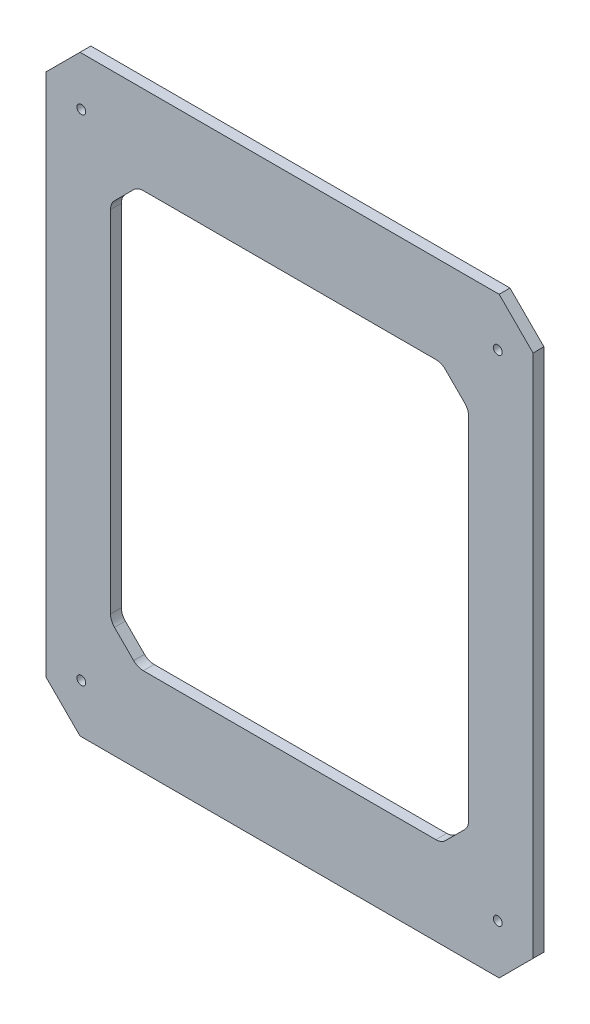
ISO-10303-21;
HEADER;
FILE_DESCRIPTION(('STEP AP214'),'2;1');
FILE_NAME('part.step','',(''),(''),'','','');
FILE_SCHEMA(('AUTOMOTIVE_DESIGN { 1 0 10303 214 1 1 1 1 }'));
ENDSEC;
DATA;
#1=APPLICATION_CONTEXT('core data for automotive mechanical design processes');
#2=APPLICATION_PROTOCOL_DEFINITION('international standard','automotive_design',2000,#1);
#3=PRODUCT_CONTEXT('',#1,'mechanical');
#4=PRODUCT('Part','Part','',(#3));
#5=PRODUCT_RELATED_PRODUCT_CATEGORY('part','',(#4));
#6=PRODUCT_DEFINITION_FORMATION('','',#4);
#7=PRODUCT_DEFINITION_CONTEXT('part definition',#1,'design');
#8=PRODUCT_DEFINITION('design','',#6,#7);
#9=PRODUCT_DEFINITION_SHAPE('','',#8);
#10=(LENGTH_UNIT() NAMED_UNIT(*) SI_UNIT(.MILLI.,.METRE.));
#11=(NAMED_UNIT(*) PLANE_ANGLE_UNIT() SI_UNIT($,.RADIAN.));
#12=(NAMED_UNIT(*) SI_UNIT($,.STERADIAN.) SOLID_ANGLE_UNIT());
#13=UNCERTAINTY_MEASURE_WITH_UNIT(LENGTH_MEASURE(1.E-05),#10,'distance_accuracy_value','');
#14=(GEOMETRIC_REPRESENTATION_CONTEXT(3) GLOBAL_UNCERTAINTY_ASSIGNED_CONTEXT((#13)) GLOBAL_UNIT_ASSIGNED_CONTEXT((#10,
#11,#12)) REPRESENTATION_CONTEXT('',''));
#15=CARTESIAN_POINT('',(0.,0.,0.));
#16=DIRECTION('',(0.,0.,1.));
#17=DIRECTION('',(1.,0.,0.));
#18=AXIS2_PLACEMENT_3D('',#15,#16,#17);
#19=CARTESIAN_POINT('',(0.,0.,0.));
#20=DIRECTION('',(0.,0.,1.));
#21=DIRECTION('',(1.,0.,0.));
#22=AXIS2_PLACEMENT_3D('',#19,#20,#21);
#23=PLANE('',#22);
#24=CARTESIAN_POINT('',(153.5,-182.25,0.));
#25=DIRECTION('',(0.,0.,-1.));
#26=DIRECTION('',(-1.,0.,0.));
#27=AXIS2_PLACEMENT_3D('',#24,#25,#26);
#28=CIRCLE('',#27,3.25);
#29=CARTESIAN_POINT('',(150.25,-182.25,0.));
#30=VERTEX_POINT('',#29);
#31=EDGE_CURVE('E521',#30,#30,#28,.T.);
#32=ORIENTED_EDGE('',*,*,#31,.F.);
#33=EDGE_LOOP('',(#32));
#34=FACE_BOUND('',#33,.T.);
#35=CARTESIAN_POINT('',(-153.5,-182.25,0.));
#36=DIRECTION('',(0.,0.,-1.));
#37=DIRECTION('',(-1.,0.,0.));
#38=AXIS2_PLACEMENT_3D('',#35,#36,#37);
#39=CIRCLE('',#38,3.25);
#40=CARTESIAN_POINT('',(-156.75,-182.25,0.));
#41=VERTEX_POINT('',#40);
#42=EDGE_CURVE('E523',#41,#41,#39,.T.);
#43=ORIENTED_EDGE('',*,*,#42,.F.);
#44=EDGE_LOOP('',(#43));
#45=FACE_BOUND('',#44,.T.);
#46=CARTESIAN_POINT('',(153.5,182.25,0.));
#47=DIRECTION('',(0.,0.,-1.));
#48=DIRECTION('',(-1.,0.,0.));
#49=AXIS2_PLACEMENT_3D('',#46,#47,#48);
#50=CIRCLE('',#49,3.25);
#51=CARTESIAN_POINT('',(150.25,182.25,0.));
#52=VERTEX_POINT('',#51);
#53=EDGE_CURVE('E531',#52,#52,#50,.T.);
#54=ORIENTED_EDGE('',*,*,#53,.F.);
#55=EDGE_LOOP('',(#54));
#56=FACE_BOUND('',#55,.T.);
#57=DIRECTION('',(-1.,0.,0.));
#58=VECTOR('',#57,1.);
#59=CARTESIAN_POINT('',(107.857864328668,-153.249999986913,0.));
#60=LINE('',#59,#58);
#61=CARTESIAN_POINT('',(107.857864328668,-153.249999986913,0.));
#62=VERTEX_POINT('',#61);
#63=CARTESIAN_POINT('',(-107.857864423332,-153.249999986913,0.));
#64=VERTEX_POINT('',#63);
#65=EDGE_CURVE('E261',#62,#64,#60,.T.);
#66=ORIENTED_EDGE('',*,*,#65,.F.);
#67=CARTESIAN_POINT('',(107.857864328668,-143.24999998392,0.));
#68=DIRECTION('',(0.,0.,-1.));
#69=DIRECTION('',(-1.,0.,0.));
#70=AXIS2_PLACEMENT_3D('',#67,#68,#69);
#71=CIRCLE('',#70,10.0000000029924);
#72=CARTESIAN_POINT('',(114.928932142649,-150.321067797902,0.));
#73=VERTEX_POINT('',#72);
#74=EDGE_CURVE('E50',#73,#62,#71,.T.);
#75=ORIENTED_EDGE('',*,*,#74,.F.);
#76=DIRECTION('',(-0.707106781186549,-0.707106781186546,0.));
#77=VECTOR('',#76,1.);
#78=CARTESIAN_POINT('',(129.07106776665,-136.178932173902,0.));
#79=LINE('',#78,#77);
#80=CARTESIAN_POINT('',(129.07106776665,-136.178932173902,0.));
#81=VERTEX_POINT('',#80);
#82=EDGE_CURVE('E214',#81,#73,#79,.T.);
#83=ORIENTED_EDGE('',*,*,#82,.F.);
#84=CARTESIAN_POINT('',(121.999999968748,-129.107864376,0.));
#85=DIRECTION('',(0.,0.,-1.));
#86=DIRECTION('',(-1.,0.,0.));
#87=AXIS2_PLACEMENT_3D('',#84,#85,#86);
#88=CIRCLE('',#87,9.99999998025205);
#89=CARTESIAN_POINT('',(131.999999949,-129.107864376,0.));
#90=VERTEX_POINT('',#89);
#91=EDGE_CURVE('E217',#90,#81,#88,.T.);
#92=ORIENTED_EDGE('',*,*,#91,.F.);
#93=DIRECTION('',(0.,-1.,0.));
#94=VECTOR('',#93,1.);
#95=CARTESIAN_POINT('',(131.999999949,129.107864376,0.));
#96=LINE('',#95,#94);
#97=CARTESIAN_POINT('',(131.999999949,129.107864376,0.));
#98=VERTEX_POINT('',#97);
#99=EDGE_CURVE('E296',#98,#90,#96,.T.);
#100=ORIENTED_EDGE('',*,*,#99,.F.);
#101=CARTESIAN_POINT('',(121.999999968796,129.107864376,0.));
#102=DIRECTION('',(0.,0.,-1.));
#103=DIRECTION('',(-1.,0.,0.));
#104=AXIS2_PLACEMENT_3D('',#101,#102,#103);
#105=CIRCLE('',#104,9.99999998020447);
#106=CARTESIAN_POINT('',(129.071067766664,136.178932173868,0.));
#107=VERTEX_POINT('',#106);
#108=EDGE_CURVE('E293',#107,#98,#105,.T.);
#109=ORIENTED_EDGE('',*,*,#108,.F.);
#110=DIRECTION('',(0.707106781186548,-0.707106781186547,0.));
#111=VECTOR('',#110,1.);
#112=CARTESIAN_POINT('',(114.928932142663,150.321067797868,0.));
#113=LINE('',#112,#111);
#114=CARTESIAN_POINT('',(114.928932142663,150.321067797868,0.));
#115=VERTEX_POINT('',#114);
#116=EDGE_CURVE('E290',#115,#107,#113,.T.);
#117=ORIENTED_EDGE('',*,*,#116,.F.);
#118=CARTESIAN_POINT('',(107.857864328648,143.249999983853,0.));
#119=DIRECTION('',(0.,0.,-1.));
#120=DIRECTION('',(-1.,0.,0.));
#121=AXIS2_PLACEMENT_3D('',#118,#119,#120);
#122=CIRCLE('',#121,10.00000000304);
#123=CARTESIAN_POINT('',(107.857864328648,153.249999986893,0.));
#124=VERTEX_POINT('',#123);
#125=EDGE_CURVE('E287',#124,#115,#122,.T.);
#126=ORIENTED_EDGE('',*,*,#125,.F.);
#127=DIRECTION('',(1.,0.,0.));
#128=VECTOR('',#127,1.);
#129=CARTESIAN_POINT('',(-107.857864423352,153.249999986893,0.));
#130=LINE('',#129,#128);
#131=CARTESIAN_POINT('',(-107.857864423352,153.249999986893,0.));
#132=VERTEX_POINT('',#131);
#133=EDGE_CURVE('E284',#132,#124,#130,.T.);
#134=ORIENTED_EDGE('',*,*,#133,.F.);
#135=CARTESIAN_POINT('',(-107.857864423352,143.2499999839,0.));
#136=DIRECTION('',(0.,0.,-1.));
#137=DIRECTION('',(-1.,0.,0.));
#138=AXIS2_PLACEMENT_3D('',#135,#136,#137);
#139=CIRCLE('',#138,10.0000000029925);
#140=CARTESIAN_POINT('',(-114.928932237333,150.321067797882,0.));
#141=VERTEX_POINT('',#140);
#142=EDGE_CURVE('E281',#141,#132,#139,.T.);
#143=ORIENTED_EDGE('',*,*,#142,.F.);
#144=DIRECTION('',(0.707106781186547,0.707106781186548,0.));
#145=VECTOR('',#144,1.);
#146=CARTESIAN_POINT('',(-129.071067861333,136.178932173882,0.));
#147=LINE('',#146,#145);
#148=CARTESIAN_POINT('',(-129.071067861333,136.178932173882,0.));
#149=VERTEX_POINT('',#148);
#150=EDGE_CURVE('E278',#149,#141,#147,.T.);
#151=ORIENTED_EDGE('',*,*,#150,.F.);
#152=CARTESIAN_POINT('',(-122.000000063432,129.10786437598,0.));
#153=DIRECTION('',(0.,0.,-1.));
#154=DIRECTION('',(-1.,0.,0.));
#155=AXIS2_PLACEMENT_3D('',#152,#153,#154);
#156=CIRCLE('',#155,9.99999998025202);
#157=CARTESIAN_POINT('',(-132.000000043684,129.10786437598,0.));
#158=VERTEX_POINT('',#157);
#159=EDGE_CURVE('E275',#158,#149,#156,.T.);
#160=ORIENTED_EDGE('',*,*,#159,.F.);
#161=DIRECTION('',(0.,1.,0.));
#162=VECTOR('',#161,1.);
#163=CARTESIAN_POINT('',(-132.000000043684,-129.10786437602,0.));
#164=LINE('',#163,#162);
#165=CARTESIAN_POINT('',(-132.000000043684,-129.10786437602,0.));
#166=VERTEX_POINT('',#165);
#167=EDGE_CURVE('E272',#166,#158,#164,.T.);
#168=ORIENTED_EDGE('',*,*,#167,.F.);
#169=CARTESIAN_POINT('',(-122.000000063479,-129.10786437602,0.));
#170=DIRECTION('',(0.,0.,-1.));
#171=DIRECTION('',(-1.,0.,0.));
#172=AXIS2_PLACEMENT_3D('',#169,#170,#171);
#173=CIRCLE('',#172,9.99999998020443);
#174=CARTESIAN_POINT('',(-129.071067861347,-136.178932173888,0.));
#175=VERTEX_POINT('',#174);
#176=EDGE_CURVE('E269',#175,#166,#173,.T.);
#177=ORIENTED_EDGE('',*,*,#176,.F.);
#178=DIRECTION('',(-0.707106781186548,0.707106781186548,0.));
#179=VECTOR('',#178,1.);
#180=CARTESIAN_POINT('',(-114.928932237347,-150.321067797888,0.));
#181=LINE('',#180,#179);
#182=CARTESIAN_POINT('',(-114.928932237347,-150.321067797888,0.));
#183=VERTEX_POINT('',#182);
#184=EDGE_CURVE('E266',#183,#175,#181,.T.);
#185=ORIENTED_EDGE('',*,*,#184,.F.);
#186=CARTESIAN_POINT('',(-107.857864423332,-143.249999983872,0.));
#187=DIRECTION('',(0.,0.,-1.));
#188=DIRECTION('',(-1.,0.,0.));
#189=AXIS2_PLACEMENT_3D('',#186,#187,#188);
#190=CIRCLE('',#189,10.00000000304);
#191=EDGE_CURVE('E263',#64,#183,#190,.T.);
#192=ORIENTED_EDGE('',*,*,#191,.F.);
#193=EDGE_LOOP('',(#66,#75,#83,#92,#100,#109,#117,#126,#134,#143,#151,#160,#168,#177,#185,#192));
#194=FACE_BOUND('',#193,.T.);
#195=DIRECTION('',(0.707106781186548,-0.707106781186548,0.));
#196=VECTOR('',#195,1.);
#197=CARTESIAN_POINT('',(-179.5,-193.24999991575,0.));
#198=LINE('',#197,#196);
#199=CARTESIAN_POINT('',(-179.5,-193.24999991575,0.));
#200=VERTEX_POINT('',#199);
#201=CARTESIAN_POINT('',(-154.499999958625,-218.249999957125,0.));
#202=VERTEX_POINT('',#201);
#203=EDGE_CURVE('E331',#200,#202,#198,.T.);
#204=ORIENTED_EDGE('',*,*,#203,.F.);
#205=DIRECTION('',(0.,-1.,0.));
#206=VECTOR('',#205,1.);
#207=CARTESIAN_POINT('',(-179.5,193.24999991575,0.));
#208=LINE('',#207,#206);
#209=CARTESIAN_POINT('',(-179.5,193.24999991575,0.));
#210=VERTEX_POINT('',#209);
#211=EDGE_CURVE('E353',#210,#200,#208,.T.);
#212=ORIENTED_EDGE('',*,*,#211,.F.);
#213=DIRECTION('',(-0.707106781186547,-0.707106781186548,0.));
#214=VECTOR('',#213,1.);
#215=CARTESIAN_POINT('',(-154.499999958625,218.249999957125,0.));
#216=LINE('',#215,#214);
#217=CARTESIAN_POINT('',(-154.499999958625,218.249999957125,0.));
#218=VERTEX_POINT('',#217);
#219=EDGE_CURVE('E350',#218,#210,#216,.T.);
#220=ORIENTED_EDGE('',*,*,#219,.F.);
#221=DIRECTION('',(-1.,0.,0.));
#222=VECTOR('',#221,1.);
#223=CARTESIAN_POINT('',(154.500000044375,218.249999957125,0.));
#224=LINE('',#223,#222);
#225=CARTESIAN_POINT('',(154.500000044375,218.249999957125,0.));
#226=VERTEX_POINT('',#225);
#227=EDGE_CURVE('E347',#226,#218,#224,.T.);
#228=ORIENTED_EDGE('',*,*,#227,.F.);
#229=DIRECTION('',(-0.707106781186548,0.707106781186547,0.));
#230=VECTOR('',#229,1.);
#231=CARTESIAN_POINT('',(179.50000008575,193.24999991575,0.));
#232=LINE('',#231,#230);
#233=CARTESIAN_POINT('',(179.50000008575,193.24999991575,0.));
#234=VERTEX_POINT('',#233);
#235=EDGE_CURVE('E344',#234,#226,#232,.T.);
#236=ORIENTED_EDGE('',*,*,#235,.F.);
#237=DIRECTION('',(0.,1.,0.));
#238=VECTOR('',#237,1.);
#239=CARTESIAN_POINT('',(179.50000008575,-193.24999991575,0.));
#240=LINE('',#239,#238);
#241=CARTESIAN_POINT('',(179.50000008575,-193.24999991575,0.));
#242=VERTEX_POINT('',#241);
#243=EDGE_CURVE('E341',#242,#234,#240,.T.);
#244=ORIENTED_EDGE('',*,*,#243,.F.);
#245=DIRECTION('',(0.707106781186548,0.707106781186548,0.));
#246=VECTOR('',#245,1.);
#247=CARTESIAN_POINT('',(154.500000044375,-218.249999957125,0.));
#248=LINE('',#247,#246);
#249=CARTESIAN_POINT('',(154.500000044375,-218.249999957125,0.));
#250=VERTEX_POINT('',#249);
#251=EDGE_CURVE('E338',#250,#242,#248,.T.);
#252=ORIENTED_EDGE('',*,*,#251,.F.);
#253=DIRECTION('',(1.,0.,0.));
#254=VECTOR('',#253,1.);
#255=CARTESIAN_POINT('',(-154.499999958625,-218.249999957125,0.));
#256=LINE('',#255,#254);
#257=EDGE_CURVE('E334',#202,#250,#256,.T.);
#258=ORIENTED_EDGE('',*,*,#257,.F.);
#259=EDGE_LOOP('',(#204,#212,#220,#228,#236,#244,#252,#258));
#260=FACE_BOUND('',#259,.T.);
#261=CARTESIAN_POINT('',(-153.5,182.25,0.));
#262=DIRECTION('',(0.,0.,-1.));
#263=DIRECTION('',(-1.,0.,0.));
#264=AXIS2_PLACEMENT_3D('',#261,#262,#263);
#265=CIRCLE('',#264,3.25);
#266=CARTESIAN_POINT('',(-156.75,182.25,0.));
#267=VERTEX_POINT('',#266);
#268=EDGE_CURVE('E536',#267,#267,#265,.T.);
#269=ORIENTED_EDGE('',*,*,#268,.F.);
#270=EDGE_LOOP('',(#269));
#271=FACE_BOUND('',#270,.T.);
#272=ADVANCED_FACE('F33',(#34,#45,#56,#194,#260,#271),#23,.F.);
#273=CARTESIAN_POINT('',(0.,0.,8.));
#274=DIRECTION('',(0.,0.,1.));
#275=DIRECTION('',(1.,0.,0.));
#276=AXIS2_PLACEMENT_3D('',#273,#274,#275);
#277=PLANE('',#276);
#278=CARTESIAN_POINT('',(153.5,-182.25,8.00000000000001));
#279=DIRECTION('',(0.,0.,-1.));
#280=DIRECTION('',(-1.,0.,0.));
#281=AXIS2_PLACEMENT_3D('',#278,#279,#280);
#282=CIRCLE('',#281,3.25);
#283=CARTESIAN_POINT('',(150.25,-182.25,8.00000000000001));
#284=VERTEX_POINT('',#283);
#285=EDGE_CURVE('E519',#284,#284,#282,.T.);
#286=ORIENTED_EDGE('',*,*,#285,.T.);
#287=EDGE_LOOP('',(#286));
#288=FACE_BOUND('',#287,.T.);
#289=CARTESIAN_POINT('',(-153.5,-182.25,8.00000000000001));
#290=DIRECTION('',(0.,0.,-1.));
#291=DIRECTION('',(-1.,0.,0.));
#292=AXIS2_PLACEMENT_3D('',#289,#290,#291);
#293=CIRCLE('',#292,3.25);
#294=CARTESIAN_POINT('',(-156.75,-182.25,8.00000000000001));
#295=VERTEX_POINT('',#294);
#296=EDGE_CURVE('E528',#295,#295,#293,.T.);
#297=ORIENTED_EDGE('',*,*,#296,.T.);
#298=EDGE_LOOP('',(#297));
#299=FACE_BOUND('',#298,.T.);
#300=CARTESIAN_POINT('',(153.5,182.25,8.00000000000001));
#301=DIRECTION('',(0.,0.,-1.));
#302=DIRECTION('',(-1.,0.,0.));
#303=AXIS2_PLACEMENT_3D('',#300,#301,#302);
#304=CIRCLE('',#303,3.25);
#305=CARTESIAN_POINT('',(150.25,182.25,8.00000000000001));
#306=VERTEX_POINT('',#305);
#307=EDGE_CURVE('E534',#306,#306,#304,.T.);
#308=ORIENTED_EDGE('',*,*,#307,.T.);
#309=EDGE_LOOP('',(#308));
#310=FACE_BOUND('',#309,.T.);
#311=DIRECTION('',(0.707106781186548,-0.707106781186548,0.));
#312=VECTOR('',#311,1.);
#313=CARTESIAN_POINT('',(-179.5,-193.24999991575,8.));
#314=LINE('',#313,#312);
#315=CARTESIAN_POINT('',(-179.5,-193.24999991575,8.));
#316=VERTEX_POINT('',#315);
#317=CARTESIAN_POINT('',(-154.499999958625,-218.249999957125,8.));
#318=VERTEX_POINT('',#317);
#319=EDGE_CURVE('E303',#316,#318,#314,.T.);
#320=ORIENTED_EDGE('',*,*,#319,.T.);
#321=DIRECTION('',(1.,0.,0.));
#322=VECTOR('',#321,1.);
#323=CARTESIAN_POINT('',(-154.499999958625,-218.249999957125,8.));
#324=LINE('',#323,#322);
#325=CARTESIAN_POINT('',(154.500000044375,-218.249999957125,8.));
#326=VERTEX_POINT('',#325);
#327=EDGE_CURVE('E358',#318,#326,#324,.T.);
#328=ORIENTED_EDGE('',*,*,#327,.T.);
#329=DIRECTION('',(0.707106781186548,0.707106781186548,0.));
#330=VECTOR('',#329,1.);
#331=CARTESIAN_POINT('',(154.500000044375,-218.249999957125,8.));
#332=LINE('',#331,#330);
#333=CARTESIAN_POINT('',(179.50000008575,-193.24999991575,8.));
#334=VERTEX_POINT('',#333);
#335=EDGE_CURVE('E361',#326,#334,#332,.T.);
#336=ORIENTED_EDGE('',*,*,#335,.T.);
#337=DIRECTION('',(0.,1.,0.));
#338=VECTOR('',#337,1.);
#339=CARTESIAN_POINT('',(179.50000008575,-193.24999991575,8.));
#340=LINE('',#339,#338);
#341=CARTESIAN_POINT('',(179.50000008575,193.24999991575,8.));
#342=VERTEX_POINT('',#341);
#343=EDGE_CURVE('E364',#334,#342,#340,.T.);
#344=ORIENTED_EDGE('',*,*,#343,.T.);
#345=DIRECTION('',(-0.707106781186548,0.707106781186547,0.));
#346=VECTOR('',#345,1.);
#347=CARTESIAN_POINT('',(179.50000008575,193.24999991575,8.));
#348=LINE('',#347,#346);
#349=CARTESIAN_POINT('',(154.500000044375,218.249999957125,8.));
#350=VERTEX_POINT('',#349);
#351=EDGE_CURVE('E367',#342,#350,#348,.T.);
#352=ORIENTED_EDGE('',*,*,#351,.T.);
#353=DIRECTION('',(-1.,0.,0.));
#354=VECTOR('',#353,1.);
#355=CARTESIAN_POINT('',(154.500000044375,218.249999957125,8.));
#356=LINE('',#355,#354);
#357=CARTESIAN_POINT('',(-154.499999958625,218.249999957125,8.));
#358=VERTEX_POINT('',#357);
#359=EDGE_CURVE('E370',#350,#358,#356,.T.);
#360=ORIENTED_EDGE('',*,*,#359,.T.);
#361=DIRECTION('',(-0.707106781186547,-0.707106781186548,0.));
#362=VECTOR('',#361,1.);
#363=CARTESIAN_POINT('',(-154.499999958625,218.249999957125,8.));
#364=LINE('',#363,#362);
#365=CARTESIAN_POINT('',(-179.5,193.24999991575,8.));
#366=VERTEX_POINT('',#365);
#367=EDGE_CURVE('E373',#358,#366,#364,.T.);
#368=ORIENTED_EDGE('',*,*,#367,.T.);
#369=DIRECTION('',(0.,-1.,0.));
#370=VECTOR('',#369,1.);
#371=CARTESIAN_POINT('',(-179.5,193.24999991575,8.));
#372=LINE('',#371,#370);
#373=EDGE_CURVE('E335',#366,#316,#372,.T.);
#374=ORIENTED_EDGE('',*,*,#373,.T.);
#375=EDGE_LOOP('',(#320,#328,#336,#344,#352,#360,#368,#374));
#376=FACE_BOUND('',#375,.T.);
#377=CARTESIAN_POINT('',(107.857864328668,-143.24999998392,8.));
#378=DIRECTION('',(0.,0.,-1.));
#379=DIRECTION('',(-1.,0.,0.));
#380=AXIS2_PLACEMENT_3D('',#377,#378,#379);
#381=CIRCLE('',#380,10.0000000029924);
#382=CARTESIAN_POINT('',(114.928932142649,-150.321067797902,8.));
#383=VERTEX_POINT('',#382);
#384=CARTESIAN_POINT('',(107.857864328668,-153.249999986913,8.));
#385=VERTEX_POINT('',#384);
#386=EDGE_CURVE('E197',#383,#385,#381,.T.);
#387=ORIENTED_EDGE('',*,*,#386,.T.);
#388=DIRECTION('',(-1.,0.,0.));
#389=VECTOR('',#388,1.);
#390=CARTESIAN_POINT('',(107.857864328668,-153.249999986913,8.));
#391=LINE('',#390,#389);
#392=CARTESIAN_POINT('',(-107.857864423332,-153.249999986913,8.));
#393=VERTEX_POINT('',#392);
#394=EDGE_CURVE('E206',#385,#393,#391,.T.);
#395=ORIENTED_EDGE('',*,*,#394,.T.);
#396=CARTESIAN_POINT('',(-107.857864423332,-143.249999983872,8.));
#397=DIRECTION('',(0.,0.,-1.));
#398=DIRECTION('',(-1.,0.,0.));
#399=AXIS2_PLACEMENT_3D('',#396,#397,#398);
#400=CIRCLE('',#399,10.00000000304);
#401=CARTESIAN_POINT('',(-114.928932237347,-150.321067797888,8.));
#402=VERTEX_POINT('',#401);
#403=EDGE_CURVE('E58',#393,#402,#400,.T.);
#404=ORIENTED_EDGE('',*,*,#403,.T.);
#405=DIRECTION('',(-0.707106781186548,0.707106781186548,0.));
#406=VECTOR('',#405,1.);
#407=CARTESIAN_POINT('',(-114.928932237347,-150.321067797888,8.));
#408=LINE('',#407,#406);
#409=CARTESIAN_POINT('',(-129.071067861347,-136.178932173888,8.));
#410=VERTEX_POINT('',#409);
#411=EDGE_CURVE('E224',#402,#410,#408,.T.);
#412=ORIENTED_EDGE('',*,*,#411,.T.);
#413=CARTESIAN_POINT('',(-122.000000063479,-129.10786437602,8.));
#414=DIRECTION('',(0.,0.,-1.));
#415=DIRECTION('',(-1.,0.,0.));
#416=AXIS2_PLACEMENT_3D('',#413,#414,#415);
#417=CIRCLE('',#416,9.99999998020443);
#418=CARTESIAN_POINT('',(-132.000000043684,-129.10786437602,8.));
#419=VERTEX_POINT('',#418);
#420=EDGE_CURVE('E227',#410,#419,#417,.T.);
#421=ORIENTED_EDGE('',*,*,#420,.T.);
#422=DIRECTION('',(0.,1.,0.));
#423=VECTOR('',#422,1.);
#424=CARTESIAN_POINT('',(-132.000000043684,-129.10786437602,8.));
#425=LINE('',#424,#423);
#426=CARTESIAN_POINT('',(-132.000000043684,129.10786437598,8.));
#427=VERTEX_POINT('',#426);
#428=EDGE_CURVE('E230',#419,#427,#425,.T.);
#429=ORIENTED_EDGE('',*,*,#428,.T.);
#430=CARTESIAN_POINT('',(-122.000000063432,129.10786437598,8.));
#431=DIRECTION('',(0.,0.,-1.));
#432=DIRECTION('',(-1.,0.,0.));
#433=AXIS2_PLACEMENT_3D('',#430,#431,#432);
#434=CIRCLE('',#433,9.99999998025202);
#435=CARTESIAN_POINT('',(-129.071067861333,136.178932173882,8.));
#436=VERTEX_POINT('',#435);
#437=EDGE_CURVE('E233',#427,#436,#434,.T.);
#438=ORIENTED_EDGE('',*,*,#437,.T.);
#439=DIRECTION('',(0.707106781186547,0.707106781186548,0.));
#440=VECTOR('',#439,1.);
#441=CARTESIAN_POINT('',(-129.071067861333,136.178932173882,8.));
#442=LINE('',#441,#440);
#443=CARTESIAN_POINT('',(-114.928932237333,150.321067797882,8.));
#444=VERTEX_POINT('',#443);
#445=EDGE_CURVE('E236',#436,#444,#442,.T.);
#446=ORIENTED_EDGE('',*,*,#445,.T.);
#447=CARTESIAN_POINT('',(-107.857864423352,143.2499999839,8.));
#448=DIRECTION('',(0.,0.,-1.));
#449=DIRECTION('',(-1.,0.,0.));
#450=AXIS2_PLACEMENT_3D('',#447,#448,#449);
#451=CIRCLE('',#450,10.0000000029925);
#452=CARTESIAN_POINT('',(-107.857864423352,153.249999986893,8.));
#453=VERTEX_POINT('',#452);
#454=EDGE_CURVE('E239',#444,#453,#451,.T.);
#455=ORIENTED_EDGE('',*,*,#454,.T.);
#456=DIRECTION('',(1.,0.,0.));
#457=VECTOR('',#456,1.);
#458=CARTESIAN_POINT('',(-107.857864423352,153.249999986893,8.));
#459=LINE('',#458,#457);
#460=CARTESIAN_POINT('',(107.857864328648,153.249999986893,8.));
#461=VERTEX_POINT('',#460);
#462=EDGE_CURVE('E242',#453,#461,#459,.T.);
#463=ORIENTED_EDGE('',*,*,#462,.T.);
#464=CARTESIAN_POINT('',(107.857864328648,143.249999983853,8.));
#465=DIRECTION('',(0.,0.,-1.));
#466=DIRECTION('',(-1.,0.,0.));
#467=AXIS2_PLACEMENT_3D('',#464,#465,#466);
#468=CIRCLE('',#467,10.00000000304);
#469=CARTESIAN_POINT('',(114.928932142663,150.321067797868,8.));
#470=VERTEX_POINT('',#469);
#471=EDGE_CURVE('E245',#461,#470,#468,.T.);
#472=ORIENTED_EDGE('',*,*,#471,.T.);
#473=DIRECTION('',(0.707106781186548,-0.707106781186547,0.));
#474=VECTOR('',#473,1.);
#475=CARTESIAN_POINT('',(114.928932142663,150.321067797868,8.));
#476=LINE('',#475,#474);
#477=CARTESIAN_POINT('',(129.071067766664,136.178932173868,8.));
#478=VERTEX_POINT('',#477);
#479=EDGE_CURVE('E248',#470,#478,#476,.T.);
#480=ORIENTED_EDGE('',*,*,#479,.T.);
#481=CARTESIAN_POINT('',(121.999999968796,129.107864376,8.));
#482=DIRECTION('',(0.,0.,-1.));
#483=DIRECTION('',(-1.,0.,0.));
#484=AXIS2_PLACEMENT_3D('',#481,#482,#483);
#485=CIRCLE('',#484,9.99999998020447);
#486=CARTESIAN_POINT('',(131.999999949,129.107864376,8.));
#487=VERTEX_POINT('',#486);
#488=EDGE_CURVE('E251',#478,#487,#485,.T.);
#489=ORIENTED_EDGE('',*,*,#488,.T.);
#490=DIRECTION('',(0.,-1.,0.));
#491=VECTOR('',#490,1.);
#492=CARTESIAN_POINT('',(131.999999949,129.107864376,8.));
#493=LINE('',#492,#491);
#494=CARTESIAN_POINT('',(131.999999949,-129.107864376,8.));
#495=VERTEX_POINT('',#494);
#496=EDGE_CURVE('E254',#487,#495,#493,.T.);
#497=ORIENTED_EDGE('',*,*,#496,.T.);
#498=CARTESIAN_POINT('',(121.999999968748,-129.107864376,8.));
#499=DIRECTION('',(0.,0.,-1.));
#500=DIRECTION('',(-1.,0.,0.));
#501=AXIS2_PLACEMENT_3D('',#498,#499,#500);
#502=CIRCLE('',#501,9.99999998025205);
#503=CARTESIAN_POINT('',(129.07106776665,-136.178932173902,8.));
#504=VERTEX_POINT('',#503);
#505=EDGE_CURVE('E257',#495,#504,#502,.T.);
#506=ORIENTED_EDGE('',*,*,#505,.T.);
#507=DIRECTION('',(-0.707106781186549,-0.707106781186546,0.));
#508=VECTOR('',#507,1.);
#509=CARTESIAN_POINT('',(129.07106776665,-136.178932173902,8.));
#510=LINE('',#509,#508);
#511=EDGE_CURVE('E203',#504,#383,#510,.T.);
#512=ORIENTED_EDGE('',*,*,#511,.T.);
#513=EDGE_LOOP('',(#387,#395,#404,#412,#421,#429,#438,#446,#455,#463,#472,#480,#489,#497,#506,#512));
#514=FACE_BOUND('',#513,.T.);
#515=CARTESIAN_POINT('',(-153.5,182.25,8.00000000000001));
#516=DIRECTION('',(0.,0.,-1.));
#517=DIRECTION('',(-1.,0.,0.));
#518=AXIS2_PLACEMENT_3D('',#515,#516,#517);
#519=CIRCLE('',#518,3.25);
#520=CARTESIAN_POINT('',(-156.75,182.25,8.00000000000001));
#521=VERTEX_POINT('',#520);
#522=EDGE_CURVE('E220',#521,#521,#519,.T.);
#523=ORIENTED_EDGE('',*,*,#522,.T.);
#524=EDGE_LOOP('',(#523));
#525=FACE_BOUND('',#524,.T.);
#526=ADVANCED_FACE('F210',(#288,#299,#310,#376,#514,#525),#277,.T.);
#527=CARTESIAN_POINT('',(-179.5,-193.24999991575,0.));
#528=DIRECTION('',(-0.707106781186548,-0.707106781186548,0.));
#529=DIRECTION('',(0.707106781186548,-0.707106781186548,0.));
#530=AXIS2_PLACEMENT_3D('',#527,#528,#529);
#531=PLANE('',#530);
#532=ORIENTED_EDGE('',*,*,#319,.F.);
#533=DIRECTION('',(0.,0.,1.));
#534=VECTOR('',#533,1.);
#535=CARTESIAN_POINT('',(-179.5,-193.24999991575,0.));
#536=LINE('',#535,#534);
#537=EDGE_CURVE('E11',#200,#316,#536,.T.);
#538=ORIENTED_EDGE('',*,*,#537,.F.);
#539=ORIENTED_EDGE('',*,*,#203,.T.);
#540=DIRECTION('',(0.,0.,1.));
#541=VECTOR('',#540,1.);
#542=CARTESIAN_POINT('',(-154.499999958625,-218.249999957125,0.));
#543=LINE('',#542,#541);
#544=EDGE_CURVE('E37',#202,#318,#543,.T.);
#545=ORIENTED_EDGE('',*,*,#544,.T.);
#546=EDGE_LOOP('',(#532,#538,#539,#545));
#547=FACE_BOUND('',#546,.T.);
#548=ADVANCED_FACE('F35',(#547),#531,.T.);
#549=CARTESIAN_POINT('',(-179.5,193.24999991575,0.));
#550=DIRECTION('',(-1.,0.,0.));
#551=DIRECTION('',(0.,-1.,0.));
#552=AXIS2_PLACEMENT_3D('',#549,#550,#551);
#553=PLANE('',#552);
#554=ORIENTED_EDGE('',*,*,#373,.F.);
#555=DIRECTION('',(0.,0.,1.));
#556=VECTOR('',#555,1.);
#557=CARTESIAN_POINT('',(-179.5,193.24999991575,0.));
#558=LINE('',#557,#556);
#559=EDGE_CURVE('E42',#210,#366,#558,.T.);
#560=ORIENTED_EDGE('',*,*,#559,.F.);
#561=ORIENTED_EDGE('',*,*,#211,.T.);
#562=ORIENTED_EDGE('',*,*,#537,.T.);
#563=EDGE_LOOP('',(#554,#560,#561,#562));
#564=FACE_BOUND('',#563,.T.);
#565=ADVANCED_FACE('F399',(#564),#553,.T.);
#566=CARTESIAN_POINT('',(-154.499999958625,218.249999957125,0.));
#567=DIRECTION('',(-0.707106781186548,0.707106781186547,0.));
#568=DIRECTION('',(-0.707106781186547,-0.707106781186548,0.));
#569=AXIS2_PLACEMENT_3D('',#566,#567,#568);
#570=PLANE('',#569);
#571=ORIENTED_EDGE('',*,*,#367,.F.);
#572=DIRECTION('',(0.,0.,1.));
#573=VECTOR('',#572,1.);
#574=CARTESIAN_POINT('',(-154.499999958625,218.249999957125,0.));
#575=LINE('',#574,#573);
#576=EDGE_CURVE('E379',#218,#358,#575,.T.);
#577=ORIENTED_EDGE('',*,*,#576,.F.);
#578=ORIENTED_EDGE('',*,*,#219,.T.);
#579=ORIENTED_EDGE('',*,*,#559,.T.);
#580=EDGE_LOOP('',(#571,#577,#578,#579));
#581=FACE_BOUND('',#580,.T.);
#582=ADVANCED_FACE('F420',(#581),#570,.T.);
#583=CARTESIAN_POINT('',(154.500000044375,218.249999957125,0.));
#584=DIRECTION('',(0.,1.,0.));
#585=DIRECTION('',(-1.,0.,0.));
#586=AXIS2_PLACEMENT_3D('',#583,#584,#585);
#587=PLANE('',#586);
#588=ORIENTED_EDGE('',*,*,#359,.F.);
#589=DIRECTION('',(0.,0.,1.));
#590=VECTOR('',#589,1.);
#591=CARTESIAN_POINT('',(154.500000044375,218.249999957125,0.));
#592=LINE('',#591,#590);
#593=EDGE_CURVE('E381',#226,#350,#592,.T.);
#594=ORIENTED_EDGE('',*,*,#593,.F.);
#595=ORIENTED_EDGE('',*,*,#227,.T.);
#596=ORIENTED_EDGE('',*,*,#576,.T.);
#597=EDGE_LOOP('',(#588,#594,#595,#596));
#598=FACE_BOUND('',#597,.T.);
#599=ADVANCED_FACE('F418',(#598),#587,.T.);
#600=CARTESIAN_POINT('',(179.50000008575,193.24999991575,0.));
#601=DIRECTION('',(0.707106781186547,0.707106781186548,0.));
#602=DIRECTION('',(-0.707106781186548,0.707106781186547,0.));
#603=AXIS2_PLACEMENT_3D('',#600,#601,#602);
#604=PLANE('',#603);
#605=ORIENTED_EDGE('',*,*,#351,.F.);
#606=DIRECTION('',(0.,0.,1.));
#607=VECTOR('',#606,1.);
#608=CARTESIAN_POINT('',(179.50000008575,193.24999991575,0.));
#609=LINE('',#608,#607);
#610=EDGE_CURVE('E383',#234,#342,#609,.T.);
#611=ORIENTED_EDGE('',*,*,#610,.F.);
#612=ORIENTED_EDGE('',*,*,#235,.T.);
#613=ORIENTED_EDGE('',*,*,#593,.T.);
#614=EDGE_LOOP('',(#605,#611,#612,#613));
#615=FACE_BOUND('',#614,.T.);
#616=ADVANCED_FACE('F414',(#615),#604,.T.);
#617=CARTESIAN_POINT('',(179.50000008575,-193.24999991575,0.));
#618=DIRECTION('',(1.,0.,0.));
#619=DIRECTION('',(0.,0.,-1.));
#620=AXIS2_PLACEMENT_3D('',#617,#618,#619);
#621=PLANE('',#620);
#622=ORIENTED_EDGE('',*,*,#343,.F.);
#623=DIRECTION('',(0.,0.,1.));
#624=VECTOR('',#623,1.);
#625=CARTESIAN_POINT('',(179.50000008575,-193.24999991575,0.));
#626=LINE('',#625,#624);
#627=EDGE_CURVE('E385',#242,#334,#626,.T.);
#628=ORIENTED_EDGE('',*,*,#627,.F.);
#629=ORIENTED_EDGE('',*,*,#243,.T.);
#630=ORIENTED_EDGE('',*,*,#610,.T.);
#631=EDGE_LOOP('',(#622,#628,#629,#630));
#632=FACE_BOUND('',#631,.T.);
#633=ADVANCED_FACE('F412',(#632),#621,.T.);
#634=CARTESIAN_POINT('',(154.500000044375,-218.249999957125,0.));
#635=DIRECTION('',(0.707106781186548,-0.707106781186548,0.));
#636=DIRECTION('',(0.707106781186548,0.707106781186548,0.));
#637=AXIS2_PLACEMENT_3D('',#634,#635,#636);
#638=PLANE('',#637);
#639=ORIENTED_EDGE('',*,*,#335,.F.);
#640=DIRECTION('',(0.,0.,1.));
#641=VECTOR('',#640,1.);
#642=CARTESIAN_POINT('',(154.500000044375,-218.249999957125,0.));
#643=LINE('',#642,#641);
#644=EDGE_CURVE('E386',#250,#326,#643,.T.);
#645=ORIENTED_EDGE('',*,*,#644,.F.);
#646=ORIENTED_EDGE('',*,*,#251,.T.);
#647=ORIENTED_EDGE('',*,*,#627,.T.);
#648=EDGE_LOOP('',(#639,#645,#646,#647));
#649=FACE_BOUND('',#648,.T.);
#650=ADVANCED_FACE('F408',(#649),#638,.T.);
#651=CARTESIAN_POINT('',(-154.499999958625,-218.249999957125,0.));
#652=DIRECTION('',(0.,-1.,0.));
#653=DIRECTION('',(0.,0.,-1.));
#654=AXIS2_PLACEMENT_3D('',#651,#652,#653);
#655=PLANE('',#654);
#656=ORIENTED_EDGE('',*,*,#327,.F.);
#657=ORIENTED_EDGE('',*,*,#544,.F.);
#658=ORIENTED_EDGE('',*,*,#257,.T.);
#659=ORIENTED_EDGE('',*,*,#644,.T.);
#660=EDGE_LOOP('',(#656,#657,#658,#659));
#661=FACE_BOUND('',#660,.T.);
#662=ADVANCED_FACE('F394',(#661),#655,.T.);
#663=CARTESIAN_POINT('',(107.857864328668,-143.24999998392,8.));
#664=DIRECTION('',(0.,0.,-1.));
#665=DIRECTION('',(-1.,0.,0.));
#666=AXIS2_PLACEMENT_3D('',#663,#664,#665);
#667=CYLINDRICAL_SURFACE('',#666,10.0000000029924);
#668=ORIENTED_EDGE('',*,*,#74,.T.);
#669=DIRECTION('',(0.,0.,-1.));
#670=VECTOR('',#669,1.);
#671=CARTESIAN_POINT('',(107.857864328668,-153.249999986913,8.));
#672=LINE('',#671,#670);
#673=EDGE_CURVE('E193',#385,#62,#672,.T.);
#674=ORIENTED_EDGE('',*,*,#673,.F.);
#675=ORIENTED_EDGE('',*,*,#386,.F.);
#676=DIRECTION('',(0.,0.,-1.));
#677=VECTOR('',#676,1.);
#678=CARTESIAN_POINT('',(114.928932142649,-150.321067797902,8.));
#679=LINE('',#678,#677);
#680=EDGE_CURVE('E301',#383,#73,#679,.T.);
#681=ORIENTED_EDGE('',*,*,#680,.T.);
#682=EDGE_LOOP('',(#668,#674,#675,#681));
#683=FACE_BOUND('',#682,.T.);
#684=ADVANCED_FACE('F195',(#683),#667,.F.);
#685=CARTESIAN_POINT('',(129.07106776665,-136.178932173902,8.));
#686=DIRECTION('',(0.707106781186546,-0.707106781186549,0.));
#687=DIRECTION('',(0.707106781186549,0.707106781186546,0.));
#688=AXIS2_PLACEMENT_3D('',#685,#686,#687);
#689=PLANE('',#688);
#690=ORIENTED_EDGE('',*,*,#82,.T.);
#691=ORIENTED_EDGE('',*,*,#680,.F.);
#692=ORIENTED_EDGE('',*,*,#511,.F.);
#693=DIRECTION('',(0.,0.,-1.));
#694=VECTOR('',#693,1.);
#695=CARTESIAN_POINT('',(129.07106776665,-136.178932173902,8.));
#696=LINE('',#695,#694);
#697=EDGE_CURVE('E304',#504,#81,#696,.T.);
#698=ORIENTED_EDGE('',*,*,#697,.T.);
#699=EDGE_LOOP('',(#690,#691,#692,#698));
#700=FACE_BOUND('',#699,.T.);
#701=ADVANCED_FACE('F442',(#700),#689,.F.);
#702=CARTESIAN_POINT('',(121.999999968748,-129.107864376,8.));
#703=DIRECTION('',(0.,0.,-1.));
#704=DIRECTION('',(-1.,0.,0.));
#705=AXIS2_PLACEMENT_3D('',#702,#703,#704);
#706=CYLINDRICAL_SURFACE('',#705,9.99999998025205);
#707=ORIENTED_EDGE('',*,*,#91,.T.);
#708=ORIENTED_EDGE('',*,*,#697,.F.);
#709=ORIENTED_EDGE('',*,*,#505,.F.);
#710=DIRECTION('',(0.,0.,-1.));
#711=VECTOR('',#710,1.);
#712=CARTESIAN_POINT('',(131.999999949,-129.107864376,8.));
#713=LINE('',#712,#711);
#714=EDGE_CURVE('E306',#495,#90,#713,.T.);
#715=ORIENTED_EDGE('',*,*,#714,.T.);
#716=EDGE_LOOP('',(#707,#708,#709,#715));
#717=FACE_BOUND('',#716,.T.);
#718=ADVANCED_FACE('F492',(#717),#706,.F.);
#719=CARTESIAN_POINT('',(131.999999949,129.107864376,8.));
#720=DIRECTION('',(1.,0.,0.));
#721=DIRECTION('',(0.,0.,-1.));
#722=AXIS2_PLACEMENT_3D('',#719,#720,#721);
#723=PLANE('',#722);
#724=ORIENTED_EDGE('',*,*,#99,.T.);
#725=ORIENTED_EDGE('',*,*,#714,.F.);
#726=ORIENTED_EDGE('',*,*,#496,.F.);
#727=DIRECTION('',(0.,0.,-1.));
#728=VECTOR('',#727,1.);
#729=CARTESIAN_POINT('',(131.999999949,129.107864376,8.));
#730=LINE('',#729,#728);
#731=EDGE_CURVE('E308',#487,#98,#730,.T.);
#732=ORIENTED_EDGE('',*,*,#731,.T.);
#733=EDGE_LOOP('',(#724,#725,#726,#732));
#734=FACE_BOUND('',#733,.T.);
#735=ADVANCED_FACE('F488',(#734),#723,.F.);
#736=CARTESIAN_POINT('',(121.999999968796,129.107864376,8.));
#737=DIRECTION('',(0.,0.,-1.));
#738=DIRECTION('',(-1.,0.,0.));
#739=AXIS2_PLACEMENT_3D('',#736,#737,#738);
#740=CYLINDRICAL_SURFACE('',#739,9.99999998020447);
#741=ORIENTED_EDGE('',*,*,#108,.T.);
#742=ORIENTED_EDGE('',*,*,#731,.F.);
#743=ORIENTED_EDGE('',*,*,#488,.F.);
#744=DIRECTION('',(0.,0.,-1.));
#745=VECTOR('',#744,1.);
#746=CARTESIAN_POINT('',(129.071067766664,136.178932173868,8.));
#747=LINE('',#746,#745);
#748=EDGE_CURVE('E310',#478,#107,#747,.T.);
#749=ORIENTED_EDGE('',*,*,#748,.T.);
#750=EDGE_LOOP('',(#741,#742,#743,#749));
#751=FACE_BOUND('',#750,.T.);
#752=ADVANCED_FACE('F484',(#751),#740,.F.);
#753=CARTESIAN_POINT('',(114.928932142663,150.321067797868,8.));
#754=DIRECTION('',(0.707106781186547,0.707106781186548,0.));
#755=DIRECTION('',(-0.707106781186548,0.707106781186547,0.));
#756=AXIS2_PLACEMENT_3D('',#753,#754,#755);
#757=PLANE('',#756);
#758=ORIENTED_EDGE('',*,*,#116,.T.);
#759=ORIENTED_EDGE('',*,*,#748,.F.);
#760=ORIENTED_EDGE('',*,*,#479,.F.);
#761=DIRECTION('',(0.,0.,-1.));
#762=VECTOR('',#761,1.);
#763=CARTESIAN_POINT('',(114.928932142663,150.321067797868,8.));
#764=LINE('',#763,#762);
#765=EDGE_CURVE('E312',#470,#115,#764,.T.);
#766=ORIENTED_EDGE('',*,*,#765,.T.);
#767=EDGE_LOOP('',(#758,#759,#760,#766));
#768=FACE_BOUND('',#767,.T.);
#769=ADVANCED_FACE('F480',(#768),#757,.F.);
#770=CARTESIAN_POINT('',(107.857864328648,143.249999983853,8.));
#771=DIRECTION('',(0.,0.,-1.));
#772=DIRECTION('',(-1.,0.,0.));
#773=AXIS2_PLACEMENT_3D('',#770,#771,#772);
#774=CYLINDRICAL_SURFACE('',#773,10.00000000304);
#775=ORIENTED_EDGE('',*,*,#125,.T.);
#776=ORIENTED_EDGE('',*,*,#765,.F.);
#777=ORIENTED_EDGE('',*,*,#471,.F.);
#778=DIRECTION('',(0.,0.,-1.));
#779=VECTOR('',#778,1.);
#780=CARTESIAN_POINT('',(107.857864328648,153.249999986893,8.));
#781=LINE('',#780,#779);
#782=EDGE_CURVE('E314',#461,#124,#781,.T.);
#783=ORIENTED_EDGE('',*,*,#782,.T.);
#784=EDGE_LOOP('',(#775,#776,#777,#783));
#785=FACE_BOUND('',#784,.T.);
#786=ADVANCED_FACE('F476',(#785),#774,.F.);
#787=CARTESIAN_POINT('',(-107.857864423352,153.249999986893,8.));
#788=DIRECTION('',(0.,1.,0.));
#789=DIRECTION('',(-1.,0.,0.));
#790=AXIS2_PLACEMENT_3D('',#787,#788,#789);
#791=PLANE('',#790);
#792=ORIENTED_EDGE('',*,*,#133,.T.);
#793=ORIENTED_EDGE('',*,*,#782,.F.);
#794=ORIENTED_EDGE('',*,*,#462,.F.);
#795=DIRECTION('',(0.,0.,-1.));
#796=VECTOR('',#795,1.);
#797=CARTESIAN_POINT('',(-107.857864423352,153.249999986893,8.));
#798=LINE('',#797,#796);
#799=EDGE_CURVE('E316',#453,#132,#798,.T.);
#800=ORIENTED_EDGE('',*,*,#799,.T.);
#801=EDGE_LOOP('',(#792,#793,#794,#800));
#802=FACE_BOUND('',#801,.T.);
#803=ADVANCED_FACE('F472',(#802),#791,.F.);
#804=CARTESIAN_POINT('',(-107.857864423352,143.2499999839,8.));
#805=DIRECTION('',(0.,0.,-1.));
#806=DIRECTION('',(-1.,0.,0.));
#807=AXIS2_PLACEMENT_3D('',#804,#805,#806);
#808=CYLINDRICAL_SURFACE('',#807,10.0000000029925);
#809=ORIENTED_EDGE('',*,*,#142,.T.);
#810=ORIENTED_EDGE('',*,*,#799,.F.);
#811=ORIENTED_EDGE('',*,*,#454,.F.);
#812=DIRECTION('',(0.,0.,-1.));
#813=VECTOR('',#812,1.);
#814=CARTESIAN_POINT('',(-114.928932237333,150.321067797882,8.));
#815=LINE('',#814,#813);
#816=EDGE_CURVE('E318',#444,#141,#815,.T.);
#817=ORIENTED_EDGE('',*,*,#816,.T.);
#818=EDGE_LOOP('',(#809,#810,#811,#817));
#819=FACE_BOUND('',#818,.T.);
#820=ADVANCED_FACE('F468',(#819),#808,.F.);
#821=CARTESIAN_POINT('',(-129.071067861333,136.178932173882,8.));
#822=DIRECTION('',(-0.707106781186548,0.707106781186547,0.));
#823=DIRECTION('',(-0.707106781186547,-0.707106781186548,0.));
#824=AXIS2_PLACEMENT_3D('',#821,#822,#823);
#825=PLANE('',#824);
#826=ORIENTED_EDGE('',*,*,#150,.T.);
#827=ORIENTED_EDGE('',*,*,#816,.F.);
#828=ORIENTED_EDGE('',*,*,#445,.F.);
#829=DIRECTION('',(0.,0.,-1.));
#830=VECTOR('',#829,1.);
#831=CARTESIAN_POINT('',(-129.071067861333,136.178932173882,8.));
#832=LINE('',#831,#830);
#833=EDGE_CURVE('E320',#436,#149,#832,.T.);
#834=ORIENTED_EDGE('',*,*,#833,.T.);
#835=EDGE_LOOP('',(#826,#827,#828,#834));
#836=FACE_BOUND('',#835,.T.);
#837=ADVANCED_FACE('F464',(#836),#825,.F.);
#838=CARTESIAN_POINT('',(-122.000000063432,129.10786437598,8.));
#839=DIRECTION('',(0.,0.,-1.));
#840=DIRECTION('',(-1.,0.,0.));
#841=AXIS2_PLACEMENT_3D('',#838,#839,#840);
#842=CYLINDRICAL_SURFACE('',#841,9.99999998025202);
#843=ORIENTED_EDGE('',*,*,#159,.T.);
#844=ORIENTED_EDGE('',*,*,#833,.F.);
#845=ORIENTED_EDGE('',*,*,#437,.F.);
#846=DIRECTION('',(0.,0.,-1.));
#847=VECTOR('',#846,1.);
#848=CARTESIAN_POINT('',(-132.000000043684,129.10786437598,8.));
#849=LINE('',#848,#847);
#850=EDGE_CURVE('E322',#427,#158,#849,.T.);
#851=ORIENTED_EDGE('',*,*,#850,.T.);
#852=EDGE_LOOP('',(#843,#844,#845,#851));
#853=FACE_BOUND('',#852,.T.);
#854=ADVANCED_FACE('F460',(#853),#842,.F.);
#855=CARTESIAN_POINT('',(-132.000000043684,-129.10786437602,8.));
#856=DIRECTION('',(-1.,0.,0.));
#857=DIRECTION('',(0.,0.,1.));
#858=AXIS2_PLACEMENT_3D('',#855,#856,#857);
#859=PLANE('',#858);
#860=ORIENTED_EDGE('',*,*,#167,.T.);
#861=ORIENTED_EDGE('',*,*,#850,.F.);
#862=ORIENTED_EDGE('',*,*,#428,.F.);
#863=DIRECTION('',(0.,0.,-1.));
#864=VECTOR('',#863,1.);
#865=CARTESIAN_POINT('',(-132.000000043684,-129.10786437602,8.));
#866=LINE('',#865,#864);
#867=EDGE_CURVE('E324',#419,#166,#866,.T.);
#868=ORIENTED_EDGE('',*,*,#867,.T.);
#869=EDGE_LOOP('',(#860,#861,#862,#868));
#870=FACE_BOUND('',#869,.T.);
#871=ADVANCED_FACE('F456',(#870),#859,.F.);
#872=CARTESIAN_POINT('',(-122.000000063479,-129.10786437602,8.));
#873=DIRECTION('',(0.,0.,-1.));
#874=DIRECTION('',(-1.,0.,0.));
#875=AXIS2_PLACEMENT_3D('',#872,#873,#874);
#876=CYLINDRICAL_SURFACE('',#875,9.99999998020443);
#877=ORIENTED_EDGE('',*,*,#176,.T.);
#878=ORIENTED_EDGE('',*,*,#867,.F.);
#879=ORIENTED_EDGE('',*,*,#420,.F.);
#880=DIRECTION('',(0.,0.,-1.));
#881=VECTOR('',#880,1.);
#882=CARTESIAN_POINT('',(-129.071067861347,-136.178932173888,8.));
#883=LINE('',#882,#881);
#884=EDGE_CURVE('E326',#410,#175,#883,.T.);
#885=ORIENTED_EDGE('',*,*,#884,.T.);
#886=EDGE_LOOP('',(#877,#878,#879,#885));
#887=FACE_BOUND('',#886,.T.);
#888=ADVANCED_FACE('F452',(#887),#876,.F.);
#889=CARTESIAN_POINT('',(-114.928932237347,-150.321067797888,8.));
#890=DIRECTION('',(-0.707106781186547,-0.707106781186547,0.));
#891=DIRECTION('',(0.707106781186548,-0.707106781186548,0.));
#892=AXIS2_PLACEMENT_3D('',#889,#890,#891);
#893=PLANE('',#892);
#894=ORIENTED_EDGE('',*,*,#184,.T.);
#895=ORIENTED_EDGE('',*,*,#884,.F.);
#896=ORIENTED_EDGE('',*,*,#411,.F.);
#897=DIRECTION('',(0.,0.,-1.));
#898=VECTOR('',#897,1.);
#899=CARTESIAN_POINT('',(-114.928932237347,-150.321067797888,8.));
#900=LINE('',#899,#898);
#901=EDGE_CURVE('E328',#402,#183,#900,.T.);
#902=ORIENTED_EDGE('',*,*,#901,.T.);
#903=EDGE_LOOP('',(#894,#895,#896,#902));
#904=FACE_BOUND('',#903,.T.);
#905=ADVANCED_FACE('F449',(#904),#893,.F.);
#906=CARTESIAN_POINT('',(-107.857864423332,-143.249999983872,8.));
#907=DIRECTION('',(0.,0.,-1.));
#908=DIRECTION('',(-1.,0.,0.));
#909=AXIS2_PLACEMENT_3D('',#906,#907,#908);
#910=CYLINDRICAL_SURFACE('',#909,10.00000000304);
#911=ORIENTED_EDGE('',*,*,#191,.T.);
#912=ORIENTED_EDGE('',*,*,#901,.F.);
#913=ORIENTED_EDGE('',*,*,#403,.F.);
#914=DIRECTION('',(0.,0.,-1.));
#915=VECTOR('',#914,1.);
#916=CARTESIAN_POINT('',(-107.857864423332,-153.249999986913,8.));
#917=LINE('',#916,#915);
#918=EDGE_CURVE('E202',#393,#64,#917,.T.);
#919=ORIENTED_EDGE('',*,*,#918,.T.);
#920=EDGE_LOOP('',(#911,#912,#913,#919));
#921=FACE_BOUND('',#920,.T.);
#922=ADVANCED_FACE('F446',(#921),#910,.F.);
#923=CARTESIAN_POINT('',(107.857864328668,-153.249999986913,8.));
#924=DIRECTION('',(0.,-1.,0.));
#925=DIRECTION('',(0.,0.,-1.));
#926=AXIS2_PLACEMENT_3D('',#923,#924,#925);
#927=PLANE('',#926);
#928=ORIENTED_EDGE('',*,*,#65,.T.);
#929=ORIENTED_EDGE('',*,*,#918,.F.);
#930=ORIENTED_EDGE('',*,*,#394,.F.);
#931=ORIENTED_EDGE('',*,*,#673,.T.);
#932=EDGE_LOOP('',(#928,#929,#930,#931));
#933=FACE_BOUND('',#932,.T.);
#934=ADVANCED_FACE('F207',(#933),#927,.F.);
#935=CARTESIAN_POINT('',(-153.5,182.25,0.));
#936=DIRECTION('',(0.,0.,-1.));
#937=DIRECTION('',(-1.,0.,0.));
#938=AXIS2_PLACEMENT_3D('',#935,#936,#937);
#939=CYLINDRICAL_SURFACE('',#938,3.25);
#940=ORIENTED_EDGE('',*,*,#522,.F.);
#941=EDGE_LOOP('',(#940));
#942=FACE_BOUND('',#941,.T.);
#943=ORIENTED_EDGE('',*,*,#268,.T.);
#944=EDGE_LOOP('',(#943));
#945=FACE_BOUND('',#944,.T.);
#946=ADVANCED_FACE('F445',(#942,#945),#939,.F.);
#947=CARTESIAN_POINT('',(153.5,182.25,0.));
#948=DIRECTION('',(0.,0.,-1.));
#949=DIRECTION('',(-1.,0.,0.));
#950=AXIS2_PLACEMENT_3D('',#947,#948,#949);
#951=CYLINDRICAL_SURFACE('',#950,3.25);
#952=ORIENTED_EDGE('',*,*,#307,.F.);
#953=EDGE_LOOP('',(#952));
#954=FACE_BOUND('',#953,.T.);
#955=ORIENTED_EDGE('',*,*,#53,.T.);
#956=EDGE_LOOP('',(#955));
#957=FACE_BOUND('',#956,.T.);
#958=ADVANCED_FACE('F502',(#954,#957),#951,.F.);
#959=CARTESIAN_POINT('',(-153.5,-182.25,0.));
#960=DIRECTION('',(0.,0.,-1.));
#961=DIRECTION('',(-1.,0.,0.));
#962=AXIS2_PLACEMENT_3D('',#959,#960,#961);
#963=CYLINDRICAL_SURFACE('',#962,3.25);
#964=ORIENTED_EDGE('',*,*,#296,.F.);
#965=EDGE_LOOP('',(#964));
#966=FACE_BOUND('',#965,.T.);
#967=ORIENTED_EDGE('',*,*,#42,.T.);
#968=EDGE_LOOP('',(#967));
#969=FACE_BOUND('',#968,.T.);
#970=ADVANCED_FACE('F506',(#966,#969),#963,.F.);
#971=CARTESIAN_POINT('',(153.5,-182.25,0.));
#972=DIRECTION('',(0.,0.,-1.));
#973=DIRECTION('',(-1.,0.,0.));
#974=AXIS2_PLACEMENT_3D('',#971,#972,#973);
#975=CYLINDRICAL_SURFACE('',#974,3.25);
#976=ORIENTED_EDGE('',*,*,#285,.F.);
#977=EDGE_LOOP('',(#976));
#978=FACE_BOUND('',#977,.T.);
#979=ORIENTED_EDGE('',*,*,#31,.T.);
#980=EDGE_LOOP('',(#979));
#981=FACE_BOUND('',#980,.T.);
#982=ADVANCED_FACE('F510',(#978,#981),#975,.F.);
#983=CLOSED_SHELL('',(#272,#526,#548,#565,#582,#599,#616,#633,#650,#662,#684,#701,#718,#735,
#752,#769,#786,#803,#820,#837,#854,#871,#888,#905,#922,#934,#946,#958,#970,#982));
#984=MANIFOLD_SOLID_BREP('B2',#983);
#985=ADVANCED_BREP_SHAPE_REPRESENTATION('',(#18,#984),#14);
#986=SHAPE_DEFINITION_REPRESENTATION(#9,#985);
ENDSEC;
END-ISO-10303-21;
